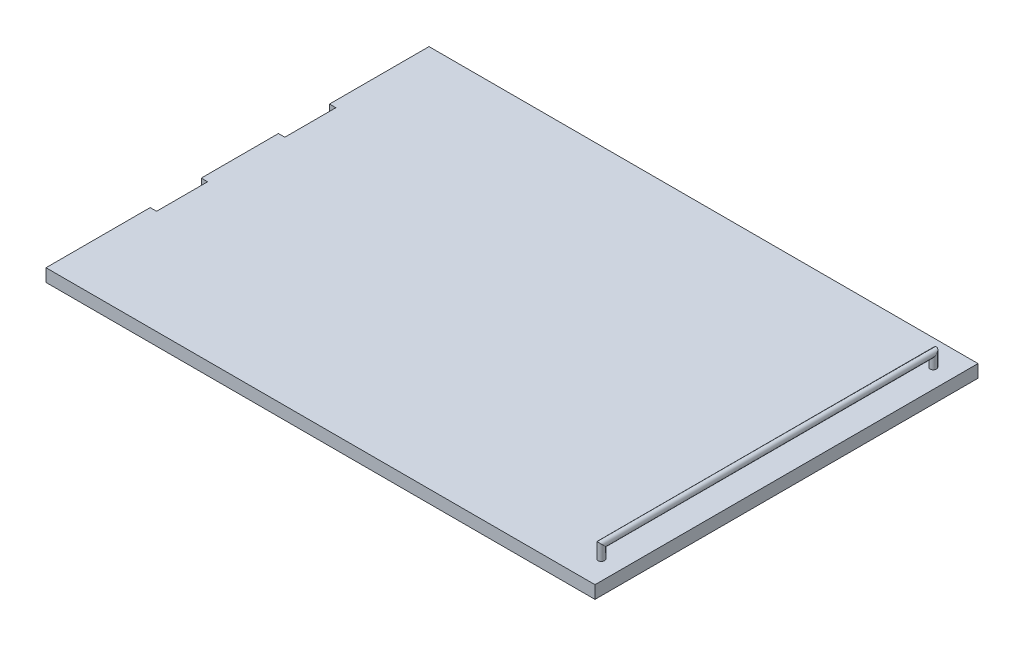
ISO-10303-21;
HEADER;
FILE_DESCRIPTION(('STEP AP214'),'2;1');
FILE_NAME('part.step','',(''),(''),'','','');
FILE_SCHEMA(('AUTOMOTIVE_DESIGN { 1 0 10303 214 1 1 1 1 }'));
ENDSEC;
DATA;
#1=APPLICATION_CONTEXT('core data for automotive mechanical design processes');
#2=APPLICATION_PROTOCOL_DEFINITION('international standard','automotive_design',2000,#1);
#3=PRODUCT_CONTEXT('',#1,'mechanical');
#4=PRODUCT('Part','Part','',(#3));
#5=PRODUCT_RELATED_PRODUCT_CATEGORY('part','',(#4));
#6=PRODUCT_DEFINITION_FORMATION('','',#4);
#7=PRODUCT_DEFINITION_CONTEXT('part definition',#1,'design');
#8=PRODUCT_DEFINITION('design','',#6,#7);
#9=PRODUCT_DEFINITION_SHAPE('','',#8);
#10=(LENGTH_UNIT() NAMED_UNIT(*) SI_UNIT(.MILLI.,.METRE.));
#11=(NAMED_UNIT(*) PLANE_ANGLE_UNIT() SI_UNIT($,.RADIAN.));
#12=(NAMED_UNIT(*) SI_UNIT($,.STERADIAN.) SOLID_ANGLE_UNIT());
#13=UNCERTAINTY_MEASURE_WITH_UNIT(LENGTH_MEASURE(1.E-05),#10,'distance_accuracy_value','');
#14=(GEOMETRIC_REPRESENTATION_CONTEXT(3) GLOBAL_UNCERTAINTY_ASSIGNED_CONTEXT((#13)) GLOBAL_UNIT_ASSIGNED_CONTEXT((#10,
#11,#12)) REPRESENTATION_CONTEXT('',''));
#15=CARTESIAN_POINT('',(0.,0.,0.));
#16=DIRECTION('',(0.,0.,1.));
#17=DIRECTION('',(1.,0.,0.));
#18=AXIS2_PLACEMENT_3D('',#15,#16,#17);
#19=CARTESIAN_POINT('',(-546.1,25.4,381.));
#20=DIRECTION('',(1.,0.,0.));
#21=DIRECTION('',(0.,0.,-1.));
#22=AXIS2_PLACEMENT_3D('',#19,#20,#21);
#23=PLANE('',#22);
#24=DIRECTION('',(0.,0.,1.));
#25=VECTOR('',#24,1.);
#26=CARTESIAN_POINT('',(-546.1,25.4,381.));
#27=LINE('',#26,#25);
#28=CARTESIAN_POINT('',(-546.1,25.4,-81.443938975774));
#29=VERTEX_POINT('',#28);
#30=CARTESIAN_POINT('',(-546.1,25.4,72.1273397431873));
#31=VERTEX_POINT('',#30);
#32=EDGE_CURVE('E233',#29,#31,#27,.T.);
#33=ORIENTED_EDGE('',*,*,#32,.F.);
#34=DIRECTION('',(0.,1.,0.));
#35=VECTOR('',#34,1.);
#36=CARTESIAN_POINT('',(-546.1,0.,-81.443938975774));
#37=LINE('',#36,#35);
#38=CARTESIAN_POINT('',(-546.1,0.,-81.443938975774));
#39=VERTEX_POINT('',#38);
#40=EDGE_CURVE('E176',#39,#29,#37,.T.);
#41=ORIENTED_EDGE('',*,*,#40,.F.);
#42=DIRECTION('',(0.,0.,1.));
#43=VECTOR('',#42,1.);
#44=CARTESIAN_POINT('',(-546.1,0.,381.));
#45=LINE('',#44,#43);
#46=CARTESIAN_POINT('',(-546.1,0.,72.1273397431873));
#47=VERTEX_POINT('',#46);
#48=EDGE_CURVE('E158',#39,#47,#45,.T.);
#49=ORIENTED_EDGE('',*,*,#48,.T.);
#50=DIRECTION('',(0.,1.,0.));
#51=VECTOR('',#50,1.);
#52=CARTESIAN_POINT('',(-546.1,0.,72.1273397431873));
#53=LINE('',#52,#51);
#54=EDGE_CURVE('E173',#47,#31,#53,.T.);
#55=ORIENTED_EDGE('',*,*,#54,.T.);
#56=EDGE_LOOP('',(#33,#41,#49,#55));
#57=FACE_BOUND('',#56,.T.);
#58=ADVANCED_FACE('F45',(#57),#23,.F.);
#59=CARTESIAN_POINT('',(-546.1,0.,-381.));
#60=VERTEX_POINT('',#59);
#61=CARTESIAN_POINT('',(-546.1,0.,-183.043938975774));
#62=VERTEX_POINT('',#61);
#63=EDGE_CURVE('E244',#60,#62,#45,.T.);
#64=ORIENTED_EDGE('',*,*,#63,.T.);
#65=DIRECTION('',(0.,1.,0.));
#66=VECTOR('',#65,1.);
#67=CARTESIAN_POINT('',(-546.1,0.,-183.043938975774));
#68=LINE('',#67,#66);
#69=CARTESIAN_POINT('',(-546.1,25.4,-183.043938975774));
#70=VERTEX_POINT('',#69);
#71=EDGE_CURVE('E180',#62,#70,#68,.T.);
#72=ORIENTED_EDGE('',*,*,#71,.T.);
#73=CARTESIAN_POINT('',(-546.1,25.4,-381.));
#74=VERTEX_POINT('',#73);
#75=EDGE_CURVE('E228',#74,#70,#27,.T.);
#76=ORIENTED_EDGE('',*,*,#75,.F.);
#77=DIRECTION('',(0.,-1.,0.));
#78=VECTOR('',#77,1.);
#79=CARTESIAN_POINT('',(-546.1,25.4,-381.));
#80=LINE('',#79,#78);
#81=EDGE_CURVE('E54',#74,#60,#80,.T.);
#82=ORIENTED_EDGE('',*,*,#81,.T.);
#83=EDGE_LOOP('',(#64,#72,#76,#82));
#84=FACE_BOUND('',#83,.T.);
#85=ADVANCED_FACE('F262',(#84),#23,.F.);
#86=CARTESIAN_POINT('',(546.1,25.4,381.));
#87=DIRECTION('',(-1.,0.,0.));
#88=DIRECTION('',(0.,0.,1.));
#89=AXIS2_PLACEMENT_3D('',#86,#87,#88);
#90=PLANE('',#89);
#91=DIRECTION('',(0.,0.,-1.));
#92=VECTOR('',#91,1.);
#93=CARTESIAN_POINT('',(546.1,0.,381.));
#94=LINE('',#93,#92);
#95=CARTESIAN_POINT('',(546.1,0.,381.));
#96=VERTEX_POINT('',#95);
#97=CARTESIAN_POINT('',(546.1,0.,-381.));
#98=VERTEX_POINT('',#97);
#99=EDGE_CURVE('E179',#96,#98,#94,.T.);
#100=ORIENTED_EDGE('',*,*,#99,.T.);
#101=DIRECTION('',(0.,-1.,0.));
#102=VECTOR('',#101,1.);
#103=CARTESIAN_POINT('',(546.1,25.4,-381.));
#104=LINE('',#103,#102);
#105=CARTESIAN_POINT('',(546.1,25.4,-381.));
#106=VERTEX_POINT('',#105);
#107=EDGE_CURVE('E12',#106,#98,#104,.T.);
#108=ORIENTED_EDGE('',*,*,#107,.F.);
#109=DIRECTION('',(0.,0.,-1.));
#110=VECTOR('',#109,1.);
#111=CARTESIAN_POINT('',(546.1,25.4,381.));
#112=LINE('',#111,#110);
#113=CARTESIAN_POINT('',(546.1,25.4,381.));
#114=VERTEX_POINT('',#113);
#115=EDGE_CURVE('E219',#114,#106,#112,.T.);
#116=ORIENTED_EDGE('',*,*,#115,.F.);
#117=DIRECTION('',(0.,-1.,0.));
#118=VECTOR('',#117,1.);
#119=CARTESIAN_POINT('',(546.1,25.4,381.));
#120=LINE('',#119,#118);
#121=EDGE_CURVE('E236',#114,#96,#120,.T.);
#122=ORIENTED_EDGE('',*,*,#121,.T.);
#123=EDGE_LOOP('',(#100,#108,#116,#122));
#124=FACE_BOUND('',#123,.T.);
#125=ADVANCED_FACE('F47',(#124),#90,.F.);
#126=CARTESIAN_POINT('',(-546.1,25.4,-381.));
#127=DIRECTION('',(0.,0.,1.));
#128=DIRECTION('',(1.,0.,0.));
#129=AXIS2_PLACEMENT_3D('',#126,#127,#128);
#130=PLANE('',#129);
#131=DIRECTION('',(-1.,0.,0.));
#132=VECTOR('',#131,1.);
#133=CARTESIAN_POINT('',(-546.1,0.,-381.));
#134=LINE('',#133,#132);
#135=EDGE_CURVE('E240',#98,#60,#134,.T.);
#136=ORIENTED_EDGE('',*,*,#135,.T.);
#137=ORIENTED_EDGE('',*,*,#81,.F.);
#138=DIRECTION('',(-1.,0.,0.));
#139=VECTOR('',#138,1.);
#140=CARTESIAN_POINT('',(-546.1,25.4,-381.));
#141=LINE('',#140,#139);
#142=EDGE_CURVE('E223',#106,#74,#141,.T.);
#143=ORIENTED_EDGE('',*,*,#142,.F.);
#144=ORIENTED_EDGE('',*,*,#107,.T.);
#145=EDGE_LOOP('',(#136,#137,#143,#144));
#146=FACE_BOUND('',#145,.T.);
#147=ADVANCED_FACE('F267',(#146),#130,.F.);
#148=CARTESIAN_POINT('',(-546.1,25.4,173.727339743187));
#149=VERTEX_POINT('',#148);
#150=CARTESIAN_POINT('',(-546.1,25.4,381.));
#151=VERTEX_POINT('',#150);
#152=EDGE_CURVE('E227',#149,#151,#27,.T.);
#153=ORIENTED_EDGE('',*,*,#152,.F.);
#154=DIRECTION('',(0.,1.,0.));
#155=VECTOR('',#154,1.);
#156=CARTESIAN_POINT('',(-546.1,0.,173.727339743187));
#157=LINE('',#156,#155);
#158=CARTESIAN_POINT('',(-546.1,0.,173.727339743187));
#159=VERTEX_POINT('',#158);
#160=EDGE_CURVE('E196',#159,#149,#157,.T.);
#161=ORIENTED_EDGE('',*,*,#160,.F.);
#162=CARTESIAN_POINT('',(-546.1,0.,381.));
#163=VERTEX_POINT('',#162);
#164=EDGE_CURVE('E243',#159,#163,#45,.T.);
#165=ORIENTED_EDGE('',*,*,#164,.T.);
#166=DIRECTION('',(0.,-1.,0.));
#167=VECTOR('',#166,1.);
#168=CARTESIAN_POINT('',(-546.1,25.4,381.));
#169=LINE('',#168,#167);
#170=EDGE_CURVE('E253',#151,#163,#169,.T.);
#171=ORIENTED_EDGE('',*,*,#170,.F.);
#172=EDGE_LOOP('',(#153,#161,#165,#171));
#173=FACE_BOUND('',#172,.T.);
#174=ADVANCED_FACE('F302',(#173),#23,.F.);
#175=CARTESIAN_POINT('',(-546.1,25.4,381.));
#176=DIRECTION('',(0.,0.,-1.));
#177=DIRECTION('',(-1.,0.,0.));
#178=AXIS2_PLACEMENT_3D('',#175,#176,#177);
#179=PLANE('',#178);
#180=DIRECTION('',(1.,0.,0.));
#181=VECTOR('',#180,1.);
#182=CARTESIAN_POINT('',(-546.1,0.,381.));
#183=LINE('',#182,#181);
#184=EDGE_CURVE('E224',#163,#96,#183,.T.);
#185=ORIENTED_EDGE('',*,*,#184,.T.);
#186=ORIENTED_EDGE('',*,*,#121,.F.);
#187=DIRECTION('',(1.,0.,0.));
#188=VECTOR('',#187,1.);
#189=CARTESIAN_POINT('',(-546.1,25.4,381.));
#190=LINE('',#189,#188);
#191=EDGE_CURVE('E232',#151,#114,#190,.T.);
#192=ORIENTED_EDGE('',*,*,#191,.F.);
#193=ORIENTED_EDGE('',*,*,#170,.T.);
#194=EDGE_LOOP('',(#185,#186,#192,#193));
#195=FACE_BOUND('',#194,.T.);
#196=ADVANCED_FACE('F273',(#195),#179,.F.);
#197=CARTESIAN_POINT('',(0.,25.4,0.));
#198=DIRECTION('',(0.,-1.,0.));
#199=DIRECTION('',(0.,0.,-1.));
#200=AXIS2_PLACEMENT_3D('',#197,#198,#199);
#201=PLANE('',#200);
#202=CARTESIAN_POINT('',(508.,25.4,330.2));
#203=DIRECTION('',(0.,-1.,0.));
#204=DIRECTION('',(0.,0.,-1.));
#205=AXIS2_PLACEMENT_3D('',#202,#203,#204);
#206=CIRCLE('',#205,6.34999999999997);
#207=CARTESIAN_POINT('',(508.,25.4,323.85));
#208=VERTEX_POINT('',#207);
#209=EDGE_CURVE('E166',#208,#208,#206,.T.);
#210=ORIENTED_EDGE('',*,*,#209,.T.);
#211=EDGE_LOOP('',(#210));
#212=FACE_BOUND('',#211,.T.);
#213=CARTESIAN_POINT('',(508.,25.4,-330.2));
#214=DIRECTION('',(0.,1.,0.));
#215=DIRECTION('',(0.,0.,1.));
#216=AXIS2_PLACEMENT_3D('',#213,#214,#215);
#217=CIRCLE('',#216,6.34999999999997);
#218=CARTESIAN_POINT('',(508.,25.4,-323.85));
#219=VERTEX_POINT('',#218);
#220=EDGE_CURVE('E342',#219,#219,#217,.T.);
#221=ORIENTED_EDGE('',*,*,#220,.F.);
#222=EDGE_LOOP('',(#221));
#223=FACE_BOUND('',#222,.T.);
#224=DIRECTION('',(0.,0.,-1.));
#225=VECTOR('',#224,1.);
#226=CARTESIAN_POINT('',(-533.4,25.4,-183.043938975774));
#227=LINE('',#226,#225);
#228=CARTESIAN_POINT('',(-533.4,25.4,-81.443938975774));
#229=VERTEX_POINT('',#228);
#230=CARTESIAN_POINT('',(-533.4,25.4,-183.043938975774));
#231=VERTEX_POINT('',#230);
#232=EDGE_CURVE('E163',#229,#231,#227,.T.);
#233=ORIENTED_EDGE('',*,*,#232,.F.);
#234=DIRECTION('',(1.,0.,0.));
#235=VECTOR('',#234,1.);
#236=CARTESIAN_POINT('',(-533.4,25.4,-81.443938975774));
#237=LINE('',#236,#235);
#238=EDGE_CURVE('E141',#29,#229,#237,.T.);
#239=ORIENTED_EDGE('',*,*,#238,.F.);
#240=ORIENTED_EDGE('',*,*,#32,.T.);
#241=DIRECTION('',(-1.,0.,0.));
#242=VECTOR('',#241,1.);
#243=CARTESIAN_POINT('',(-546.1,25.4,72.1273397431873));
#244=LINE('',#243,#242);
#245=CARTESIAN_POINT('',(-533.4,25.4,72.1273397431873));
#246=VERTEX_POINT('',#245);
#247=EDGE_CURVE('E190',#246,#31,#244,.T.);
#248=ORIENTED_EDGE('',*,*,#247,.F.);
#249=DIRECTION('',(0.,0.,-1.));
#250=VECTOR('',#249,1.);
#251=CARTESIAN_POINT('',(-533.4,25.4,72.1273397431873));
#252=LINE('',#251,#250);
#253=CARTESIAN_POINT('',(-533.4,25.4,173.727339743187));
#254=VERTEX_POINT('',#253);
#255=EDGE_CURVE('E201',#254,#246,#252,.T.);
#256=ORIENTED_EDGE('',*,*,#255,.F.);
#257=DIRECTION('',(1.,0.,0.));
#258=VECTOR('',#257,1.);
#259=CARTESIAN_POINT('',(-533.4,25.4,173.727339743187));
#260=LINE('',#259,#258);
#261=EDGE_CURVE('E197',#149,#254,#260,.T.);
#262=ORIENTED_EDGE('',*,*,#261,.F.);
#263=ORIENTED_EDGE('',*,*,#152,.T.);
#264=ORIENTED_EDGE('',*,*,#191,.T.);
#265=ORIENTED_EDGE('',*,*,#115,.T.);
#266=ORIENTED_EDGE('',*,*,#142,.T.);
#267=ORIENTED_EDGE('',*,*,#75,.T.);
#268=DIRECTION('',(-1.,0.,0.));
#269=VECTOR('',#268,1.);
#270=CARTESIAN_POINT('',(-546.1,25.4,-183.043938975774));
#271=LINE('',#270,#269);
#272=EDGE_CURVE('E160',#231,#70,#271,.T.);
#273=ORIENTED_EDGE('',*,*,#272,.F.);
#274=EDGE_LOOP('',(#233,#239,#240,#248,#256,#262,#263,#264,#265,#266,#267,#273));
#275=FACE_BOUND('',#274,.T.);
#276=ADVANCED_FACE('F284',(#212,#223,#275),#201,.F.);
#277=CARTESIAN_POINT('',(0.,0.,0.));
#278=DIRECTION('',(0.,-1.,0.));
#279=DIRECTION('',(0.,0.,-1.));
#280=AXIS2_PLACEMENT_3D('',#277,#278,#279);
#281=PLANE('',#280);
#282=DIRECTION('',(1.,0.,0.));
#283=VECTOR('',#282,1.);
#284=CARTESIAN_POINT('',(-533.4,0.,-81.443938975774));
#285=LINE('',#284,#283);
#286=CARTESIAN_POINT('',(-533.4,0.,-81.443938975774));
#287=VERTEX_POINT('',#286);
#288=EDGE_CURVE('E138',#39,#287,#285,.T.);
#289=ORIENTED_EDGE('',*,*,#288,.T.);
#290=DIRECTION('',(0.,0.,-1.));
#291=VECTOR('',#290,1.);
#292=CARTESIAN_POINT('',(-533.4,0.,-183.043938975774));
#293=LINE('',#292,#291);
#294=CARTESIAN_POINT('',(-533.4,0.,-183.043938975774));
#295=VERTEX_POINT('',#294);
#296=EDGE_CURVE('E149',#287,#295,#293,.T.);
#297=ORIENTED_EDGE('',*,*,#296,.T.);
#298=DIRECTION('',(-1.,0.,0.));
#299=VECTOR('',#298,1.);
#300=CARTESIAN_POINT('',(-546.1,0.,-183.043938975774));
#301=LINE('',#300,#299);
#302=EDGE_CURVE('E61',#295,#62,#301,.T.);
#303=ORIENTED_EDGE('',*,*,#302,.T.);
#304=ORIENTED_EDGE('',*,*,#63,.F.);
#305=ORIENTED_EDGE('',*,*,#135,.F.);
#306=ORIENTED_EDGE('',*,*,#99,.F.);
#307=ORIENTED_EDGE('',*,*,#184,.F.);
#308=ORIENTED_EDGE('',*,*,#164,.F.);
#309=DIRECTION('',(1.,0.,0.));
#310=VECTOR('',#309,1.);
#311=CARTESIAN_POINT('',(-533.4,0.,173.727339743187));
#312=LINE('',#311,#310);
#313=CARTESIAN_POINT('',(-533.4,0.,173.727339743187));
#314=VERTEX_POINT('',#313);
#315=EDGE_CURVE('E186',#159,#314,#312,.T.);
#316=ORIENTED_EDGE('',*,*,#315,.T.);
#317=DIRECTION('',(0.,0.,-1.));
#318=VECTOR('',#317,1.);
#319=CARTESIAN_POINT('',(-533.4,0.,72.1273397431873));
#320=LINE('',#319,#318);
#321=CARTESIAN_POINT('',(-533.4,0.,72.1273397431873));
#322=VERTEX_POINT('',#321);
#323=EDGE_CURVE('E69',#314,#322,#320,.T.);
#324=ORIENTED_EDGE('',*,*,#323,.T.);
#325=DIRECTION('',(-1.,0.,0.));
#326=VECTOR('',#325,1.);
#327=CARTESIAN_POINT('',(-546.1,0.,72.1273397431873));
#328=LINE('',#327,#326);
#329=EDGE_CURVE('E193',#322,#47,#328,.T.);
#330=ORIENTED_EDGE('',*,*,#329,.T.);
#331=ORIENTED_EDGE('',*,*,#48,.F.);
#332=EDGE_LOOP('',(#289,#297,#303,#304,#305,#306,#307,#308,#316,#324,#330,#331));
#333=FACE_BOUND('',#332,.T.);
#334=ADVANCED_FACE('F155',(#333),#281,.T.);
#335=CARTESIAN_POINT('',(-546.1,0.,72.1273397431873));
#336=DIRECTION('',(0.,0.,-1.));
#337=DIRECTION('',(-1.,0.,0.));
#338=AXIS2_PLACEMENT_3D('',#335,#336,#337);
#339=PLANE('',#338);
#340=ORIENTED_EDGE('',*,*,#247,.T.);
#341=ORIENTED_EDGE('',*,*,#54,.F.);
#342=ORIENTED_EDGE('',*,*,#329,.F.);
#343=DIRECTION('',(0.,1.,0.));
#344=VECTOR('',#343,1.);
#345=CARTESIAN_POINT('',(-533.4,0.,72.1273397431873));
#346=LINE('',#345,#344);
#347=EDGE_CURVE('E211',#322,#246,#346,.T.);
#348=ORIENTED_EDGE('',*,*,#347,.T.);
#349=EDGE_LOOP('',(#340,#341,#342,#348));
#350=FACE_BOUND('',#349,.T.);
#351=ADVANCED_FACE('F321',(#350),#339,.F.);
#352=CARTESIAN_POINT('',(-533.4,0.,72.1273397431873));
#353=DIRECTION('',(1.,0.,0.));
#354=DIRECTION('',(0.,0.,-1.));
#355=AXIS2_PLACEMENT_3D('',#352,#353,#354);
#356=PLANE('',#355);
#357=ORIENTED_EDGE('',*,*,#255,.T.);
#358=ORIENTED_EDGE('',*,*,#347,.F.);
#359=ORIENTED_EDGE('',*,*,#323,.F.);
#360=DIRECTION('',(0.,1.,0.));
#361=VECTOR('',#360,1.);
#362=CARTESIAN_POINT('',(-533.4,0.,173.727339743187));
#363=LINE('',#362,#361);
#364=EDGE_CURVE('E214',#314,#254,#363,.T.);
#365=ORIENTED_EDGE('',*,*,#364,.T.);
#366=EDGE_LOOP('',(#357,#358,#359,#365));
#367=FACE_BOUND('',#366,.T.);
#368=ADVANCED_FACE('F318',(#367),#356,.F.);
#369=CARTESIAN_POINT('',(-533.4,0.,173.727339743187));
#370=DIRECTION('',(0.,0.,1.));
#371=DIRECTION('',(1.,0.,0.));
#372=AXIS2_PLACEMENT_3D('',#369,#370,#371);
#373=PLANE('',#372);
#374=ORIENTED_EDGE('',*,*,#261,.T.);
#375=ORIENTED_EDGE('',*,*,#364,.F.);
#376=ORIENTED_EDGE('',*,*,#315,.F.);
#377=ORIENTED_EDGE('',*,*,#160,.T.);
#378=EDGE_LOOP('',(#374,#375,#376,#377));
#379=FACE_BOUND('',#378,.T.);
#380=ADVANCED_FACE('F297',(#379),#373,.F.);
#381=CARTESIAN_POINT('',(-533.4,0.,-81.443938975774));
#382=DIRECTION('',(0.,0.,1.));
#383=DIRECTION('',(1.,0.,0.));
#384=AXIS2_PLACEMENT_3D('',#381,#382,#383);
#385=PLANE('',#384);
#386=ORIENTED_EDGE('',*,*,#238,.T.);
#387=DIRECTION('',(0.,1.,0.));
#388=VECTOR('',#387,1.);
#389=CARTESIAN_POINT('',(-533.4,0.,-81.443938975774));
#390=LINE('',#389,#388);
#391=EDGE_CURVE('E134',#287,#229,#390,.T.);
#392=ORIENTED_EDGE('',*,*,#391,.F.);
#393=ORIENTED_EDGE('',*,*,#288,.F.);
#394=ORIENTED_EDGE('',*,*,#40,.T.);
#395=EDGE_LOOP('',(#386,#392,#393,#394));
#396=FACE_BOUND('',#395,.T.);
#397=ADVANCED_FACE('F136',(#396),#385,.F.);
#398=CARTESIAN_POINT('',(-546.1,0.,-183.043938975774));
#399=DIRECTION('',(0.,0.,-1.));
#400=DIRECTION('',(-1.,0.,0.));
#401=AXIS2_PLACEMENT_3D('',#398,#399,#400);
#402=PLANE('',#401);
#403=ORIENTED_EDGE('',*,*,#272,.T.);
#404=ORIENTED_EDGE('',*,*,#71,.F.);
#405=ORIENTED_EDGE('',*,*,#302,.F.);
#406=DIRECTION('',(0.,1.,0.));
#407=VECTOR('',#406,1.);
#408=CARTESIAN_POINT('',(-533.4,0.,-183.043938975774));
#409=LINE('',#408,#407);
#410=EDGE_CURVE('E146',#295,#231,#409,.T.);
#411=ORIENTED_EDGE('',*,*,#410,.T.);
#412=EDGE_LOOP('',(#403,#404,#405,#411));
#413=FACE_BOUND('',#412,.T.);
#414=ADVANCED_FACE('F287',(#413),#402,.F.);
#415=CARTESIAN_POINT('',(-533.4,0.,-183.043938975774));
#416=DIRECTION('',(1.,0.,0.));
#417=DIRECTION('',(0.,0.,-1.));
#418=AXIS2_PLACEMENT_3D('',#415,#416,#417);
#419=PLANE('',#418);
#420=ORIENTED_EDGE('',*,*,#232,.T.);
#421=ORIENTED_EDGE('',*,*,#410,.F.);
#422=ORIENTED_EDGE('',*,*,#296,.F.);
#423=ORIENTED_EDGE('',*,*,#391,.T.);
#424=EDGE_LOOP('',(#420,#421,#422,#423));
#425=FACE_BOUND('',#424,.T.);
#426=ADVANCED_FACE('F150',(#425),#419,.F.);
#427=CARTESIAN_POINT('',(508.,57.8849999999999,330.2));
#428=DIRECTION('',(0.,-1.,0.));
#429=DIRECTION('',(0.,0.,-1.));
#430=AXIS2_PLACEMENT_3D('',#427,#428,#429);
#431=CYLINDRICAL_SURFACE('',#430,6.34999999999997);
#432=CARTESIAN_POINT('',(508.,50.8,330.2));
#433=DIRECTION('',(0.,-0.707106781186548,0.707106781186548));
#434=DIRECTION('',(0.,0.707106781186548,0.707106781186548));
#435=AXIS2_PLACEMENT_3D('',#432,#433,#434);
#436=ELLIPSE('',#435,8.98025612106911,6.34999999999997);
#437=CARTESIAN_POINT('',(508.,57.15,336.55));
#438=VERTEX_POINT('',#437);
#439=EDGE_CURVE('E345',#438,#438,#436,.F.);
#440=ORIENTED_EDGE('',*,*,#439,.F.);
#441=EDGE_LOOP('',(#440));
#442=FACE_BOUND('',#441,.T.);
#443=ORIENTED_EDGE('',*,*,#209,.F.);
#444=EDGE_LOOP('',(#443));
#445=FACE_BOUND('',#444,.T.);
#446=ADVANCED_FACE('F294',(#442,#445),#431,.T.);
#447=CARTESIAN_POINT('',(508.,50.8,-337.285));
#448=DIRECTION('',(0.,0.,1.));
#449=DIRECTION('',(1.,0.,0.));
#450=AXIS2_PLACEMENT_3D('',#447,#448,#449);
#451=CYLINDRICAL_SURFACE('',#450,6.34999999999997);
#452=CARTESIAN_POINT('',(508.,50.8,-330.2));
#453=DIRECTION('',(0.,0.707106781186547,0.707106781186547));
#454=DIRECTION('',(0.,0.707106781186548,-0.707106781186548));
#455=AXIS2_PLACEMENT_3D('',#452,#453,#454);
#456=ELLIPSE('',#455,8.98025612106911,6.34999999999997);
#457=CARTESIAN_POINT('',(508.,57.15,-336.55));
#458=VERTEX_POINT('',#457);
#459=EDGE_CURVE('E202',#458,#458,#456,.F.);
#460=ORIENTED_EDGE('',*,*,#459,.F.);
#461=EDGE_LOOP('',(#460));
#462=FACE_BOUND('',#461,.T.);
#463=ORIENTED_EDGE('',*,*,#439,.T.);
#464=EDGE_LOOP('',(#463));
#465=FACE_BOUND('',#464,.T.);
#466=ADVANCED_FACE('F355',(#462,#465),#451,.T.);
#467=CARTESIAN_POINT('',(508.,25.4,-330.2));
#468=DIRECTION('',(0.,1.,0.));
#469=DIRECTION('',(0.,0.,1.));
#470=AXIS2_PLACEMENT_3D('',#467,#468,#469);
#471=CYLINDRICAL_SURFACE('',#470,6.34999999999997);
#472=ORIENTED_EDGE('',*,*,#220,.T.);
#473=EDGE_LOOP('',(#472));
#474=FACE_BOUND('',#473,.T.);
#475=ORIENTED_EDGE('',*,*,#459,.T.);
#476=EDGE_LOOP('',(#475));
#477=FACE_BOUND('',#476,.T.);
#478=ADVANCED_FACE('F296',(#474,#477),#471,.T.);
#479=CLOSED_SHELL('',(#58,#85,#125,#147,#174,#196,#276,#334,#351,#368,#380,#397,#414,#426,#446,
#466,#478));
#480=MANIFOLD_SOLID_BREP('B2',#479);
#481=ADVANCED_BREP_SHAPE_REPRESENTATION('',(#18,#480),#14);
#482=SHAPE_DEFINITION_REPRESENTATION(#9,#481);
ENDSEC;
END-ISO-10303-21;
